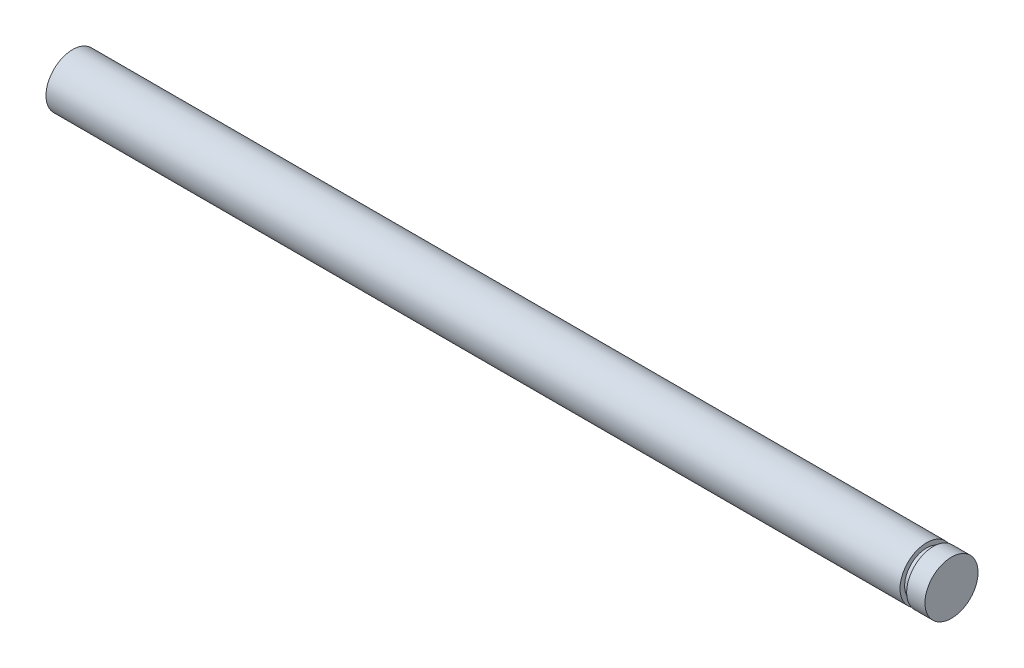
ISO-10303-21;
HEADER;
FILE_DESCRIPTION(('STEP AP214'),'2;1');
FILE_NAME('part.step','',(''),(''),'','','');
FILE_SCHEMA(('AUTOMOTIVE_DESIGN { 1 0 10303 214 1 1 1 1 }'));
ENDSEC;
DATA;
#1=APPLICATION_CONTEXT('core data for automotive mechanical design processes');
#2=APPLICATION_PROTOCOL_DEFINITION('international standard','automotive_design',2000,#1);
#3=PRODUCT_CONTEXT('',#1,'mechanical');
#4=PRODUCT('Part','Part','',(#3));
#5=PRODUCT_RELATED_PRODUCT_CATEGORY('part','',(#4));
#6=PRODUCT_DEFINITION_FORMATION('','',#4);
#7=PRODUCT_DEFINITION_CONTEXT('part definition',#1,'design');
#8=PRODUCT_DEFINITION('design','',#6,#7);
#9=PRODUCT_DEFINITION_SHAPE('','',#8);
#10=(LENGTH_UNIT() NAMED_UNIT(*) SI_UNIT(.MILLI.,.METRE.));
#11=(NAMED_UNIT(*) PLANE_ANGLE_UNIT() SI_UNIT($,.RADIAN.));
#12=(NAMED_UNIT(*) SI_UNIT($,.STERADIAN.) SOLID_ANGLE_UNIT());
#13=UNCERTAINTY_MEASURE_WITH_UNIT(LENGTH_MEASURE(1.E-05),#10,'distance_accuracy_value','');
#14=(GEOMETRIC_REPRESENTATION_CONTEXT(3) GLOBAL_UNCERTAINTY_ASSIGNED_CONTEXT((#13)) GLOBAL_UNIT_ASSIGNED_CONTEXT((#10,
#11,#12)) REPRESENTATION_CONTEXT('',''));
#15=CARTESIAN_POINT('',(0.,0.,0.));
#16=DIRECTION('',(0.,0.,1.));
#17=DIRECTION('',(1.,0.,0.));
#18=AXIS2_PLACEMENT_3D('',#15,#16,#17);
#19=CARTESIAN_POINT('',(0.,0.,0.));
#20=DIRECTION('',(-1.,0.,0.));
#21=DIRECTION('',(0.,0.,1.));
#22=AXIS2_PLACEMENT_3D('',#19,#20,#21);
#23=PLANE('',#22);
#24=CARTESIAN_POINT('',(0.,0.,0.));
#25=DIRECTION('',(-1.,0.,0.));
#26=DIRECTION('',(0.,0.,1.));
#27=AXIS2_PLACEMENT_3D('',#24,#25,#26);
#28=CIRCLE('',#27,18.4149999999999);
#29=CARTESIAN_POINT('',(0.,0.,18.4149999999999));
#30=VERTEX_POINT('',#29);
#31=EDGE_CURVE('E70',#30,#30,#28,.T.);
#32=ORIENTED_EDGE('',*,*,#31,.T.);
#33=EDGE_LOOP('',(#32));
#34=FACE_BOUND('',#33,.T.);
#35=ADVANCED_FACE('F43',(#34),#23,.T.);
#36=CARTESIAN_POINT('',(609.6,0.,0.));
#37=DIRECTION('',(1.,0.,0.));
#38=DIRECTION('',(0.,0.,-1.));
#39=AXIS2_PLACEMENT_3D('',#36,#37,#38);
#40=PLANE('',#39);
#41=CARTESIAN_POINT('',(609.6,0.,0.));
#42=DIRECTION('',(-1.,0.,0.));
#43=DIRECTION('',(0.,0.,1.));
#44=AXIS2_PLACEMENT_3D('',#41,#42,#43);
#45=CIRCLE('',#44,18.4149999999998);
#46=CARTESIAN_POINT('',(609.6,0.,18.4149999999998));
#47=VERTEX_POINT('',#46);
#48=EDGE_CURVE('E10',#47,#47,#45,.T.);
#49=ORIENTED_EDGE('',*,*,#48,.F.);
#50=EDGE_LOOP('',(#49));
#51=FACE_BOUND('',#50,.T.);
#52=ADVANCED_FACE('F88',(#51),#40,.T.);
#53=CARTESIAN_POINT('',(0.,0.,0.));
#54=DIRECTION('',(-1.,0.,0.));
#55=DIRECTION('',(0.,0.,1.));
#56=AXIS2_PLACEMENT_3D('',#53,#54,#55);
#57=CYLINDRICAL_SURFACE('',#56,18.4149999999998);
#58=ORIENTED_EDGE('',*,*,#48,.T.);
#59=EDGE_LOOP('',(#58));
#60=FACE_BOUND('',#59,.T.);
#61=CARTESIAN_POINT('',(596.9,0.,0.));
#62=DIRECTION('',(-1.,0.,0.));
#63=DIRECTION('',(0.,0.,1.));
#64=AXIS2_PLACEMENT_3D('',#61,#62,#63);
#65=CIRCLE('',#64,18.4149999999998);
#66=CARTESIAN_POINT('',(596.9,0.,18.4149999999998));
#67=VERTEX_POINT('',#66);
#68=EDGE_CURVE('E50',#67,#67,#65,.T.);
#69=ORIENTED_EDGE('',*,*,#68,.F.);
#70=EDGE_LOOP('',(#69));
#71=FACE_BOUND('',#70,.T.);
#72=ADVANCED_FACE('F92',(#60,#71),#57,.T.);
#73=CARTESIAN_POINT('',(596.9,-18.4149999999998,0.));
#74=DIRECTION('',(-1.,0.,0.));
#75=DIRECTION('',(0.,0.,1.));
#76=AXIS2_PLACEMENT_3D('',#73,#74,#75);
#77=PLANE('',#76);
#78=ORIENTED_EDGE('',*,*,#68,.T.);
#79=EDGE_LOOP('',(#78));
#80=FACE_BOUND('',#79,.T.);
#81=CARTESIAN_POINT('',(596.9,0.,0.));
#82=DIRECTION('',(-1.,0.,0.));
#83=DIRECTION('',(0.,0.,1.));
#84=AXIS2_PLACEMENT_3D('',#81,#82,#83);
#85=CIRCLE('',#84,15.2399999999999);
#86=CARTESIAN_POINT('',(596.9,0.,15.2399999999999));
#87=VERTEX_POINT('',#86);
#88=EDGE_CURVE('E55',#87,#87,#85,.T.);
#89=ORIENTED_EDGE('',*,*,#88,.F.);
#90=EDGE_LOOP('',(#89));
#91=FACE_BOUND('',#90,.T.);
#92=ADVANCED_FACE('F97',(#80,#91),#77,.T.);
#93=CARTESIAN_POINT('',(0.,0.,0.));
#94=DIRECTION('',(-1.,0.,0.));
#95=DIRECTION('',(0.,0.,1.));
#96=AXIS2_PLACEMENT_3D('',#93,#94,#95);
#97=CYLINDRICAL_SURFACE('',#96,15.2399999999999);
#98=ORIENTED_EDGE('',*,*,#88,.T.);
#99=EDGE_LOOP('',(#98));
#100=FACE_BOUND('',#99,.T.);
#101=CARTESIAN_POINT('',(592.328,0.,0.));
#102=DIRECTION('',(-1.,0.,0.));
#103=DIRECTION('',(0.,0.,1.));
#104=AXIS2_PLACEMENT_3D('',#101,#102,#103);
#105=CIRCLE('',#104,15.2399999999999);
#106=CARTESIAN_POINT('',(592.328,0.,15.2399999999999));
#107=VERTEX_POINT('',#106);
#108=EDGE_CURVE('E60',#107,#107,#105,.T.);
#109=ORIENTED_EDGE('',*,*,#108,.F.);
#110=EDGE_LOOP('',(#109));
#111=FACE_BOUND('',#110,.T.);
#112=ADVANCED_FACE('F84',(#100,#111),#97,.T.);
#113=CARTESIAN_POINT('',(592.328,-15.2399999999999,0.));
#114=DIRECTION('',(1.,0.,0.));
#115=DIRECTION('',(0.,0.,-1.));
#116=AXIS2_PLACEMENT_3D('',#113,#114,#115);
#117=PLANE('',#116);
#118=ORIENTED_EDGE('',*,*,#108,.T.);
#119=EDGE_LOOP('',(#118));
#120=FACE_BOUND('',#119,.T.);
#121=CARTESIAN_POINT('',(592.328,0.,0.));
#122=DIRECTION('',(-1.,0.,0.));
#123=DIRECTION('',(0.,0.,1.));
#124=AXIS2_PLACEMENT_3D('',#121,#122,#123);
#125=CIRCLE('',#124,18.4149999999998);
#126=CARTESIAN_POINT('',(592.328,0.,18.4149999999998));
#127=VERTEX_POINT('',#126);
#128=EDGE_CURVE('E66',#127,#127,#125,.T.);
#129=ORIENTED_EDGE('',*,*,#128,.F.);
#130=EDGE_LOOP('',(#129));
#131=FACE_BOUND('',#130,.T.);
#132=ADVANCED_FACE('F78',(#120,#131),#117,.T.);
#133=CARTESIAN_POINT('',(0.,0.,0.));
#134=DIRECTION('',(-1.,0.,0.));
#135=DIRECTION('',(0.,0.,1.));
#136=AXIS2_PLACEMENT_3D('',#133,#134,#135);
#137=CYLINDRICAL_SURFACE('',#136,18.4149999999999);
#138=ORIENTED_EDGE('',*,*,#128,.T.);
#139=EDGE_LOOP('',(#138));
#140=FACE_BOUND('',#139,.T.);
#141=ORIENTED_EDGE('',*,*,#31,.F.);
#142=EDGE_LOOP('',(#141));
#143=FACE_BOUND('',#142,.T.);
#144=ADVANCED_FACE('F76',(#140,#143),#137,.T.);
#145=CLOSED_SHELL('',(#35,#52,#72,#92,#112,#132,#144));
#146=MANIFOLD_SOLID_BREP('B2',#145);
#147=ADVANCED_BREP_SHAPE_REPRESENTATION('',(#18,#146),#14);
#148=SHAPE_DEFINITION_REPRESENTATION(#9,#147);
ENDSEC;
END-ISO-10303-21;
